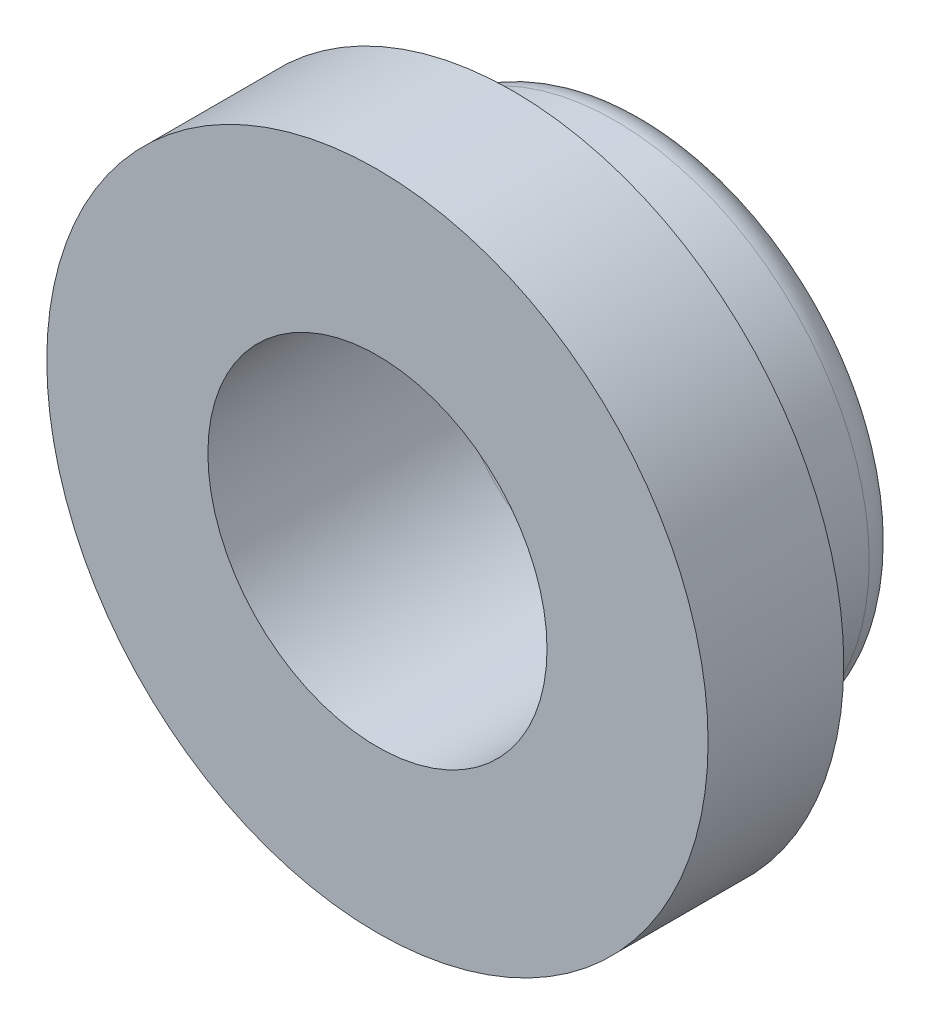
ISO-10303-21;
HEADER;
FILE_DESCRIPTION(('STEP AP214'),'2;1');
FILE_NAME('part.step','',(''),(''),'','','');
FILE_SCHEMA(('AUTOMOTIVE_DESIGN { 1 0 10303 214 1 1 1 1 }'));
ENDSEC;
DATA;
#1=APPLICATION_CONTEXT('core data for automotive mechanical design processes');
#2=APPLICATION_PROTOCOL_DEFINITION('international standard','automotive_design',2000,#1);
#3=PRODUCT_CONTEXT('',#1,'mechanical');
#4=PRODUCT('Part','Part','',(#3));
#5=PRODUCT_RELATED_PRODUCT_CATEGORY('part','',(#4));
#6=PRODUCT_DEFINITION_FORMATION('','',#4);
#7=PRODUCT_DEFINITION_CONTEXT('part definition',#1,'design');
#8=PRODUCT_DEFINITION('design','',#6,#7);
#9=PRODUCT_DEFINITION_SHAPE('','',#8);
#10=(LENGTH_UNIT() NAMED_UNIT(*) SI_UNIT(.MILLI.,.METRE.));
#11=(NAMED_UNIT(*) PLANE_ANGLE_UNIT() SI_UNIT($,.RADIAN.));
#12=(NAMED_UNIT(*) SI_UNIT($,.STERADIAN.) SOLID_ANGLE_UNIT());
#13=UNCERTAINTY_MEASURE_WITH_UNIT(LENGTH_MEASURE(1.E-05),#10,'distance_accuracy_value','');
#14=(GEOMETRIC_REPRESENTATION_CONTEXT(3) GLOBAL_UNCERTAINTY_ASSIGNED_CONTEXT((#13)) GLOBAL_UNIT_ASSIGNED_CONTEXT((#10,
#11,#12)) REPRESENTATION_CONTEXT('',''));
#15=CARTESIAN_POINT('',(0.,0.,0.));
#16=DIRECTION('',(0.,0.,1.));
#17=DIRECTION('',(1.,0.,0.));
#18=AXIS2_PLACEMENT_3D('',#15,#16,#17);
#19=CARTESIAN_POINT('',(0.,0.,4.));
#20=DIRECTION('',(0.,0.,-1.));
#21=DIRECTION('',(-1.,0.,0.));
#22=AXIS2_PLACEMENT_3D('',#19,#20,#21);
#23=CYLINDRICAL_SURFACE('',#22,3.75);
#24=CARTESIAN_POINT('',(0.,0.,0.5));
#25=DIRECTION('',(0.,0.,1.));
#26=DIRECTION('',(1.,0.,0.));
#27=AXIS2_PLACEMENT_3D('',#24,#25,#26);
#28=CIRCLE('',#27,3.75);
#29=CARTESIAN_POINT('',(3.75,0.,0.5));
#30=VERTEX_POINT('',#29);
#31=EDGE_CURVE('E49',#30,#30,#28,.T.);
#32=ORIENTED_EDGE('',*,*,#31,.T.);
#33=EDGE_LOOP('',(#32));
#34=FACE_BOUND('',#33,.T.);
#35=CARTESIAN_POINT('',(0.,0.,2.));
#36=DIRECTION('',(0.,0.,1.));
#37=DIRECTION('',(1.,0.,0.));
#38=AXIS2_PLACEMENT_3D('',#35,#36,#37);
#39=CIRCLE('',#38,3.75);
#40=CARTESIAN_POINT('',(3.75,0.,2.));
#41=VERTEX_POINT('',#40);
#42=EDGE_CURVE('E54',#41,#41,#39,.T.);
#43=ORIENTED_EDGE('',*,*,#42,.F.);
#44=EDGE_LOOP('',(#43));
#45=FACE_BOUND('',#44,.T.);
#46=ADVANCED_FACE('F34',(#34,#45),#23,.T.);
#47=CARTESIAN_POINT('',(0.,0.,0.));
#48=DIRECTION('',(0.,0.,1.));
#49=DIRECTION('',(1.,0.,0.));
#50=AXIS2_PLACEMENT_3D('',#47,#48,#49);
#51=PLANE('',#50);
#52=CARTESIAN_POINT('',(0.,0.,0.));
#53=DIRECTION('',(0.,0.,1.));
#54=DIRECTION('',(1.,0.,0.));
#55=AXIS2_PLACEMENT_3D('',#52,#53,#54);
#56=CIRCLE('',#55,3.25);
#57=CARTESIAN_POINT('',(3.25,0.,0.));
#58=VERTEX_POINT('',#57);
#59=EDGE_CURVE('E41',#58,#58,#56,.F.);
#60=ORIENTED_EDGE('',*,*,#59,.T.);
#61=EDGE_LOOP('',(#60));
#62=FACE_BOUND('',#61,.T.);
#63=CARTESIAN_POINT('',(0.,0.,0.));
#64=DIRECTION('',(0.,0.,1.));
#65=DIRECTION('',(1.,0.,0.));
#66=AXIS2_PLACEMENT_3D('',#63,#64,#65);
#67=CIRCLE('',#66,3.);
#68=CARTESIAN_POINT('',(3.,0.,0.));
#69=VERTEX_POINT('',#68);
#70=EDGE_CURVE('E45',#69,#69,#67,.T.);
#71=ORIENTED_EDGE('',*,*,#70,.T.);
#72=EDGE_LOOP('',(#71));
#73=FACE_BOUND('',#72,.T.);
#74=ADVANCED_FACE('F78',(#62,#73),#51,.F.);
#75=CARTESIAN_POINT('',(0.,0.,2.));
#76=DIRECTION('',(0.,0.,1.));
#77=DIRECTION('',(1.,0.,0.));
#78=AXIS2_PLACEMENT_3D('',#75,#76,#77);
#79=CYLINDRICAL_SURFACE('',#78,4.875);
#80=CARTESIAN_POINT('',(0.,0.,2.));
#81=DIRECTION('',(0.,0.,1.));
#82=DIRECTION('',(1.,0.,0.));
#83=AXIS2_PLACEMENT_3D('',#80,#81,#82);
#84=CIRCLE('',#83,4.875);
#85=CARTESIAN_POINT('',(4.875,0.,2.));
#86=VERTEX_POINT('',#85);
#87=EDGE_CURVE('E57',#86,#86,#84,.T.);
#88=ORIENTED_EDGE('',*,*,#87,.T.);
#89=EDGE_LOOP('',(#88));
#90=FACE_BOUND('',#89,.T.);
#91=CARTESIAN_POINT('',(0.,0.,4.));
#92=DIRECTION('',(0.,0.,1.));
#93=DIRECTION('',(1.,0.,0.));
#94=AXIS2_PLACEMENT_3D('',#91,#92,#93);
#95=CIRCLE('',#94,4.875);
#96=CARTESIAN_POINT('',(4.875,0.,4.));
#97=VERTEX_POINT('',#96);
#98=EDGE_CURVE('E58',#97,#97,#95,.T.);
#99=ORIENTED_EDGE('',*,*,#98,.F.);
#100=EDGE_LOOP('',(#99));
#101=FACE_BOUND('',#100,.T.);
#102=ADVANCED_FACE('F76',(#90,#101),#79,.T.);
#103=CARTESIAN_POINT('',(0.,0.,2.));
#104=DIRECTION('',(0.,0.,1.));
#105=DIRECTION('',(1.,0.,0.));
#106=AXIS2_PLACEMENT_3D('',#103,#104,#105);
#107=PLANE('',#106);
#108=ORIENTED_EDGE('',*,*,#42,.T.);
#109=EDGE_LOOP('',(#108));
#110=FACE_BOUND('',#109,.T.);
#111=ORIENTED_EDGE('',*,*,#87,.F.);
#112=EDGE_LOOP('',(#111));
#113=FACE_BOUND('',#112,.T.);
#114=ADVANCED_FACE('F72',(#110,#113),#107,.F.);
#115=CARTESIAN_POINT('',(0.,0.,4.));
#116=DIRECTION('',(0.,0.,1.));
#117=DIRECTION('',(1.,0.,0.));
#118=AXIS2_PLACEMENT_3D('',#115,#116,#117);
#119=PLANE('',#118);
#120=CARTESIAN_POINT('',(0.,0.,4.));
#121=DIRECTION('',(0.,0.,1.));
#122=DIRECTION('',(1.,0.,0.));
#123=AXIS2_PLACEMENT_3D('',#120,#121,#122);
#124=CIRCLE('',#123,2.5);
#125=CARTESIAN_POINT('',(2.5,0.,4.));
#126=VERTEX_POINT('',#125);
#127=EDGE_CURVE('E61',#126,#126,#124,.T.);
#128=ORIENTED_EDGE('',*,*,#127,.F.);
#129=EDGE_LOOP('',(#128));
#130=FACE_BOUND('',#129,.T.);
#131=ORIENTED_EDGE('',*,*,#98,.T.);
#132=EDGE_LOOP('',(#131));
#133=FACE_BOUND('',#132,.T.);
#134=ADVANCED_FACE('F69',(#130,#133),#119,.T.);
#135=CARTESIAN_POINT('',(0.,0.,0.));
#136=DIRECTION('',(0.,0.,1.));
#137=DIRECTION('',(1.,0.,0.));
#138=AXIS2_PLACEMENT_3D('',#135,#136,#137);
#139=CYLINDRICAL_SURFACE('',#138,2.5);
#140=CARTESIAN_POINT('',(0.,0.,0.5));
#141=DIRECTION('',(0.,0.,1.));
#142=DIRECTION('',(1.,0.,0.));
#143=AXIS2_PLACEMENT_3D('',#140,#141,#142);
#144=CIRCLE('',#143,2.5);
#145=CARTESIAN_POINT('',(2.5,0.,0.5));
#146=VERTEX_POINT('',#145);
#147=EDGE_CURVE('E10',#146,#146,#144,.F.);
#148=ORIENTED_EDGE('',*,*,#147,.T.);
#149=EDGE_LOOP('',(#148));
#150=FACE_BOUND('',#149,.T.);
#151=ORIENTED_EDGE('',*,*,#127,.T.);
#152=EDGE_LOOP('',(#151));
#153=FACE_BOUND('',#152,.T.);
#154=ADVANCED_FACE('F67',(#150,#153),#139,.F.);
#155=CARTESIAN_POINT('',(0.,0.,0.5));
#156=DIRECTION('',(0.,0.,1.));
#157=DIRECTION('',(1.,0.,0.));
#158=AXIS2_PLACEMENT_3D('',#155,#156,#157);
#159=TOROIDAL_SURFACE('',#158,3.25,0.5);
#160=ORIENTED_EDGE('',*,*,#59,.F.);
#161=EDGE_LOOP('',(#160));
#162=FACE_BOUND('',#161,.T.);
#163=ORIENTED_EDGE('',*,*,#31,.F.);
#164=EDGE_LOOP('',(#163));
#165=FACE_BOUND('',#164,.T.);
#166=ADVANCED_FACE('F94',(#162,#165),#159,.T.);
#167=CARTESIAN_POINT('',(0.,0.,0.5));
#168=DIRECTION('',(0.,0.,1.));
#169=DIRECTION('',(1.,0.,0.));
#170=AXIS2_PLACEMENT_3D('',#167,#168,#169);
#171=TOROIDAL_SURFACE('',#170,3.,0.5);
#172=ORIENTED_EDGE('',*,*,#147,.F.);
#173=EDGE_LOOP('',(#172));
#174=FACE_BOUND('',#173,.T.);
#175=ORIENTED_EDGE('',*,*,#70,.F.);
#176=EDGE_LOOP('',(#175));
#177=FACE_BOUND('',#176,.T.);
#178=ADVANCED_FACE('F36',(#174,#177),#171,.T.);
#179=CLOSED_SHELL('',(#46,#74,#102,#114,#134,#154,#166,#178));
#180=MANIFOLD_SOLID_BREP('B2',#179);
#181=ADVANCED_BREP_SHAPE_REPRESENTATION('',(#18,#180),#14);
#182=SHAPE_DEFINITION_REPRESENTATION(#9,#181);
ENDSEC;
END-ISO-10303-21;
